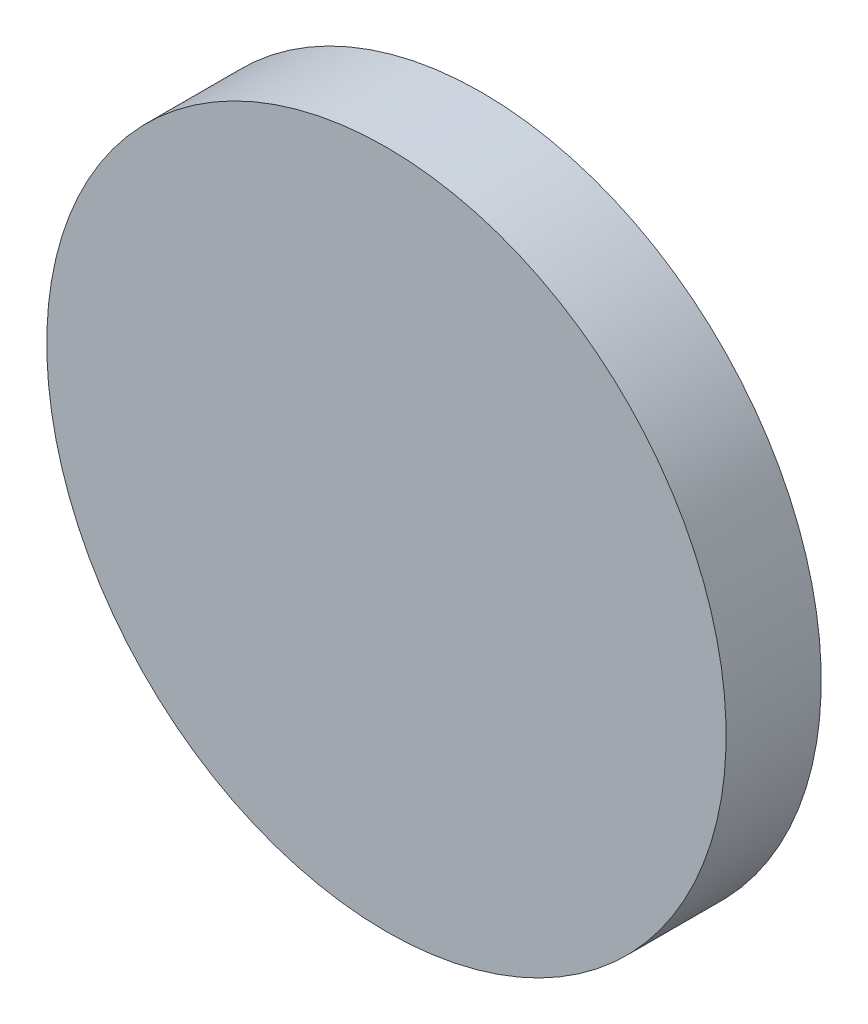
ISO-10303-21;
HEADER;
FILE_DESCRIPTION(('STEP AP214'),'2;1');
FILE_NAME('part.step','',(''),(''),'','','');
FILE_SCHEMA(('AUTOMOTIVE_DESIGN { 1 0 10303 214 1 1 1 1 }'));
ENDSEC;
DATA;
#1=APPLICATION_CONTEXT('core data for automotive mechanical design processes');
#2=APPLICATION_PROTOCOL_DEFINITION('international standard','automotive_design',2000,#1);
#3=PRODUCT_CONTEXT('',#1,'mechanical');
#4=PRODUCT('Part','Part','',(#3));
#5=PRODUCT_RELATED_PRODUCT_CATEGORY('part','',(#4));
#6=PRODUCT_DEFINITION_FORMATION('','',#4);
#7=PRODUCT_DEFINITION_CONTEXT('part definition',#1,'design');
#8=PRODUCT_DEFINITION('design','',#6,#7);
#9=PRODUCT_DEFINITION_SHAPE('','',#8);
#10=(LENGTH_UNIT() NAMED_UNIT(*) SI_UNIT(.MILLI.,.METRE.));
#11=(NAMED_UNIT(*) PLANE_ANGLE_UNIT() SI_UNIT($,.RADIAN.));
#12=(NAMED_UNIT(*) SI_UNIT($,.STERADIAN.) SOLID_ANGLE_UNIT());
#13=UNCERTAINTY_MEASURE_WITH_UNIT(LENGTH_MEASURE(1.E-05),#10,'distance_accuracy_value','');
#14=(GEOMETRIC_REPRESENTATION_CONTEXT(3) GLOBAL_UNCERTAINTY_ASSIGNED_CONTEXT((#13)) GLOBAL_UNIT_ASSIGNED_CONTEXT((#10,
#11,#12)) REPRESENTATION_CONTEXT('',''));
#15=CARTESIAN_POINT('',(0.,0.,0.));
#16=DIRECTION('',(0.,0.,1.));
#17=DIRECTION('',(1.,0.,0.));
#18=AXIS2_PLACEMENT_3D('',#15,#16,#17);
#19=CARTESIAN_POINT('',(0.,0.,0.));
#20=DIRECTION('',(0.,0.,1.));
#21=DIRECTION('',(1.,0.,0.));
#22=AXIS2_PLACEMENT_3D('',#19,#20,#21);
#23=CYLINDRICAL_SURFACE('',#22,12.5);
#24=CARTESIAN_POINT('',(0.,0.,3.5));
#25=DIRECTION('',(0.,0.,-1.));
#26=DIRECTION('',(0.,-1.,0.));
#27=AXIS2_PLACEMENT_3D('',#24,#25,#26);
#28=CIRCLE('',#27,12.5);
#29=CARTESIAN_POINT('',(0.,-12.5,3.5));
#30=VERTEX_POINT('',#29);
#31=EDGE_CURVE('E9',#30,#30,#28,.T.);
#32=ORIENTED_EDGE('',*,*,#31,.T.);
#33=EDGE_LOOP('',(#32));
#34=FACE_BOUND('',#33,.T.);
#35=CARTESIAN_POINT('',(0.,0.,0.));
#36=DIRECTION('',(0.,0.,-1.));
#37=DIRECTION('',(0.,-1.,0.));
#38=AXIS2_PLACEMENT_3D('',#35,#36,#37);
#39=CIRCLE('',#38,12.5);
#40=CARTESIAN_POINT('',(0.,-12.5,0.));
#41=VERTEX_POINT('',#40);
#42=EDGE_CURVE('E17',#41,#41,#39,.T.);
#43=ORIENTED_EDGE('',*,*,#42,.F.);
#44=EDGE_LOOP('',(#43));
#45=FACE_BOUND('',#44,.T.);
#46=ADVANCED_FACE('F14',(#34,#45),#23,.T.);
#47=CARTESIAN_POINT('',(0.,0.,3.5));
#48=DIRECTION('',(0.,0.,-1.));
#49=DIRECTION('',(-1.,0.,0.));
#50=AXIS2_PLACEMENT_3D('',#47,#48,#49);
#51=PLANE('',#50);
#52=ORIENTED_EDGE('',*,*,#31,.F.);
#53=EDGE_LOOP('',(#52));
#54=FACE_BOUND('',#53,.T.);
#55=ADVANCED_FACE('F29',(#54),#51,.F.);
#56=CARTESIAN_POINT('',(0.,0.,0.));
#57=DIRECTION('',(0.,0.,-1.));
#58=DIRECTION('',(-1.,0.,0.));
#59=AXIS2_PLACEMENT_3D('',#56,#57,#58);
#60=PLANE('',#59);
#61=ORIENTED_EDGE('',*,*,#42,.T.);
#62=EDGE_LOOP('',(#61));
#63=FACE_BOUND('',#62,.T.);
#64=ADVANCED_FACE('F26',(#63),#60,.T.);
#65=CLOSED_SHELL('',(#46,#55,#64));
#66=MANIFOLD_SOLID_BREP('B1',#65);
#67=ADVANCED_BREP_SHAPE_REPRESENTATION('',(#18,#66),#14);
#68=SHAPE_DEFINITION_REPRESENTATION(#9,#67);
ENDSEC;
END-ISO-10303-21;
